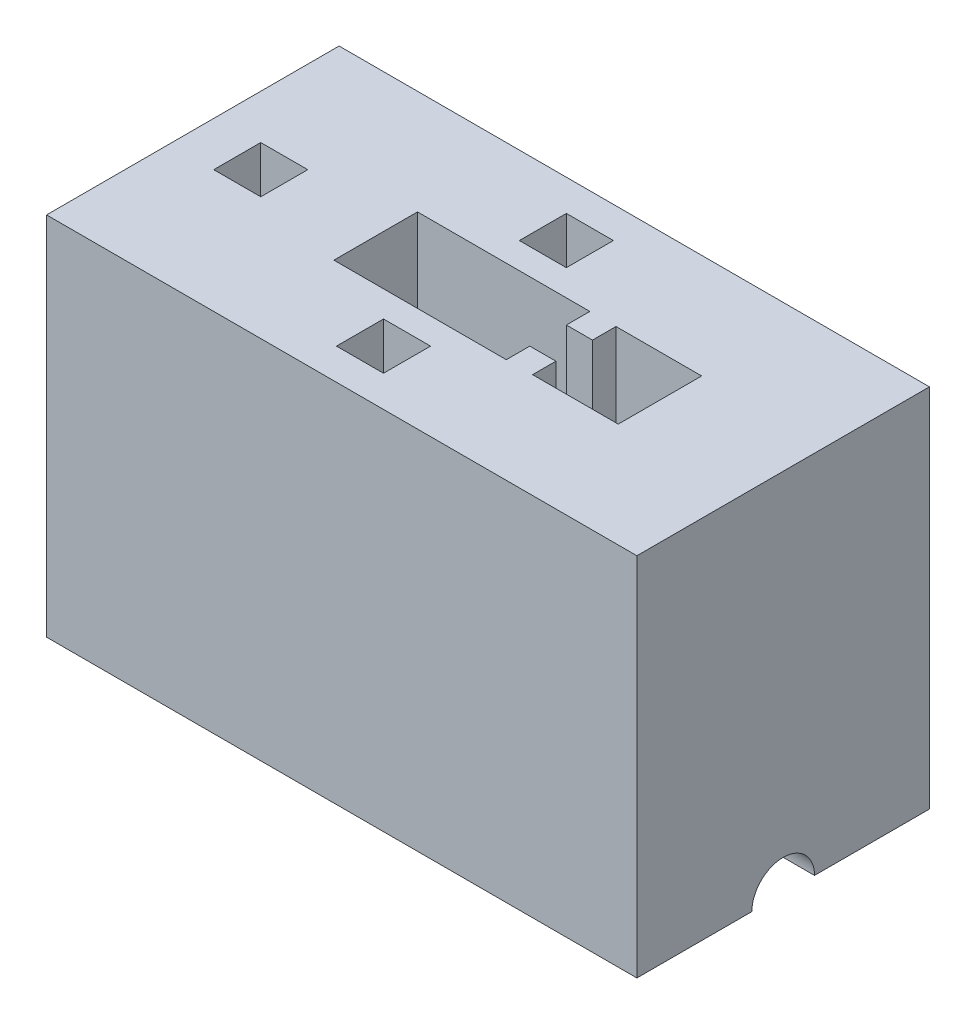
ISO-10303-21;
HEADER;
FILE_DESCRIPTION(('STEP AP214'),'2;1');
FILE_NAME('part.step','',(''),(''),'','','');
FILE_SCHEMA(('AUTOMOTIVE_DESIGN { 1 0 10303 214 1 1 1 1 }'));
ENDSEC;
DATA;
#1=APPLICATION_CONTEXT('core data for automotive mechanical design processes');
#2=APPLICATION_PROTOCOL_DEFINITION('international standard','automotive_design',2000,#1);
#3=PRODUCT_CONTEXT('',#1,'mechanical');
#4=PRODUCT('Part','Part','',(#3));
#5=PRODUCT_RELATED_PRODUCT_CATEGORY('part','',(#4));
#6=PRODUCT_DEFINITION_FORMATION('','',#4);
#7=PRODUCT_DEFINITION_CONTEXT('part definition',#1,'design');
#8=PRODUCT_DEFINITION('design','',#6,#7);
#9=PRODUCT_DEFINITION_SHAPE('','',#8);
#10=(LENGTH_UNIT() NAMED_UNIT(*) SI_UNIT(.MILLI.,.METRE.));
#11=(NAMED_UNIT(*) PLANE_ANGLE_UNIT() SI_UNIT($,.RADIAN.));
#12=(NAMED_UNIT(*) SI_UNIT($,.STERADIAN.) SOLID_ANGLE_UNIT());
#13=UNCERTAINTY_MEASURE_WITH_UNIT(LENGTH_MEASURE(1.E-05),#10,'distance_accuracy_value','');
#14=(GEOMETRIC_REPRESENTATION_CONTEXT(3) GLOBAL_UNCERTAINTY_ASSIGNED_CONTEXT((#13)) GLOBAL_UNIT_ASSIGNED_CONTEXT((#10,
#11,#12)) REPRESENTATION_CONTEXT('',''));
#15=CARTESIAN_POINT('',(0.,0.,0.));
#16=DIRECTION('',(0.,0.,1.));
#17=DIRECTION('',(1.,0.,0.));
#18=AXIS2_PLACEMENT_3D('',#15,#16,#17);
#19=CARTESIAN_POINT('',(0.,0.,0.));
#20=DIRECTION('',(0.,1.,0.));
#21=DIRECTION('',(0.,0.,1.));
#22=AXIS2_PLACEMENT_3D('',#19,#20,#21);
#23=PLANE('',#22);
#24=DIRECTION('',(0.,0.,-1.));
#25=VECTOR('',#24,1.);
#26=CARTESIAN_POINT('',(22.7334686346863,0.,-11.7533579335793));
#27=LINE('',#26,#25);
#28=CARTESIAN_POINT('',(22.7334686346864,0.,41.5866420664206));
#29=VERTEX_POINT('',#28);
#30=CARTESIAN_POINT('',(22.7334686346863,0.,13.6466420664207));
#31=VERTEX_POINT('',#30);
#32=EDGE_CURVE('E263',#29,#31,#27,.T.);
#33=ORIENTED_EDGE('',*,*,#32,.F.);
#34=DIRECTION('',(-1.,0.,0.));
#35=VECTOR('',#34,1.);
#36=CARTESIAN_POINT('',(22.7334686346864,0.,41.5866420664206));
#37=LINE('',#36,#35);
#38=CARTESIAN_POINT('',(11.9384686346863,0.,41.5866420664206));
#39=VERTEX_POINT('',#38);
#40=EDGE_CURVE('E567',#29,#39,#37,.T.);
#41=ORIENTED_EDGE('',*,*,#40,.T.);
#42=DIRECTION('',(0.,0.,1.));
#43=VECTOR('',#42,1.);
#44=CARTESIAN_POINT('',(11.9384686346863,0.,77.1466420664207));
#45=LINE('',#44,#43);
#46=CARTESIAN_POINT('',(11.9384686346863,0.,21.2666420664207));
#47=VERTEX_POINT('',#46);
#48=EDGE_CURVE('E408',#47,#39,#45,.T.);
#49=ORIENTED_EDGE('',*,*,#48,.F.);
#50=DIRECTION('',(1.,0.,0.));
#51=VECTOR('',#50,1.);
#52=CARTESIAN_POINT('',(-109.981531365314,0.,21.2666420664207));
#53=LINE('',#52,#51);
#54=CARTESIAN_POINT('',(-109.981531365314,0.,21.2666420664207));
#55=VERTEX_POINT('',#54);
#56=EDGE_CURVE('E404',#55,#47,#53,.T.);
#57=ORIENTED_EDGE('',*,*,#56,.F.);
#58=DIRECTION('',(0.,0.,-1.));
#59=VECTOR('',#58,1.);
#60=CARTESIAN_POINT('',(-109.981531365314,0.,77.1466420664207));
#61=LINE('',#60,#59);
#62=CARTESIAN_POINT('',(-109.981531365314,0.,41.5866420664206));
#63=VERTEX_POINT('',#62);
#64=EDGE_CURVE('E405',#63,#55,#61,.T.);
#65=ORIENTED_EDGE('',*,*,#64,.F.);
#66=CARTESIAN_POINT('',(-120.776531365314,0.,41.5866420664206));
#67=VERTEX_POINT('',#66);
#68=EDGE_CURVE('E52',#63,#67,#37,.T.);
#69=ORIENTED_EDGE('',*,*,#68,.T.);
#70=DIRECTION('',(0.,0.,1.));
#71=VECTOR('',#70,1.);
#72=CARTESIAN_POINT('',(-120.776531365314,0.,-11.7533579335793));
#73=LINE('',#72,#71);
#74=CARTESIAN_POINT('',(-120.776531365314,0.,13.6466420664206));
#75=VERTEX_POINT('',#74);
#76=EDGE_CURVE('E277',#75,#67,#73,.T.);
#77=ORIENTED_EDGE('',*,*,#76,.F.);
#78=DIRECTION('',(-1.,0.,0.));
#79=VECTOR('',#78,1.);
#80=CARTESIAN_POINT('',(-120.776531365314,0.,13.6466420664206));
#81=LINE('',#80,#79);
#82=EDGE_CURVE('E281',#31,#75,#81,.T.);
#83=ORIENTED_EDGE('',*,*,#82,.F.);
#84=EDGE_LOOP('',(#33,#41,#49,#57,#65,#69,#77,#83));
#85=FACE_BOUND('',#84,.T.);
#86=ADVANCED_FACE('F34',(#85),#23,.F.);
#87=CARTESIAN_POINT('',(-120.776531365314,88.9,-11.7533579335793));
#88=DIRECTION('',(1.,0.,0.));
#89=DIRECTION('',(0.,0.,-1.));
#90=AXIS2_PLACEMENT_3D('',#87,#88,#89);
#91=PLANE('',#90);
#92=ORIENTED_EDGE('',*,*,#76,.T.);
#93=CARTESIAN_POINT('',(-120.776531365314,0.,49.2066420664206));
#94=DIRECTION('',(-1.,0.,0.));
#95=DIRECTION('',(0.,0.,1.));
#96=AXIS2_PLACEMENT_3D('',#93,#94,#95);
#97=CIRCLE('',#96,7.62);
#98=CARTESIAN_POINT('',(-120.776531365314,0.,56.8266420664206));
#99=VERTEX_POINT('',#98);
#100=EDGE_CURVE('E38',#99,#67,#97,.T.);
#101=ORIENTED_EDGE('',*,*,#100,.F.);
#102=CARTESIAN_POINT('',(-120.776531365314,0.,84.7666420664206));
#103=VERTEX_POINT('',#102);
#104=EDGE_CURVE('E467',#99,#103,#73,.T.);
#105=ORIENTED_EDGE('',*,*,#104,.T.);
#106=DIRECTION('',(0.,-1.,0.));
#107=VECTOR('',#106,1.);
#108=CARTESIAN_POINT('',(-120.776531365314,88.9,84.7666420664206));
#109=LINE('',#108,#107);
#110=CARTESIAN_POINT('',(-120.776531365314,88.9,84.7666420664206));
#111=VERTEX_POINT('',#110);
#112=EDGE_CURVE('E587',#111,#103,#109,.T.);
#113=ORIENTED_EDGE('',*,*,#112,.F.);
#114=DIRECTION('',(0.,0.,1.));
#115=VECTOR('',#114,1.);
#116=CARTESIAN_POINT('',(-120.776531365314,88.9,-11.7533579335793));
#117=LINE('',#116,#115);
#118=CARTESIAN_POINT('',(-120.776531365314,88.9,13.6466420664206));
#119=VERTEX_POINT('',#118);
#120=EDGE_CURVE('E478',#119,#111,#117,.T.);
#121=ORIENTED_EDGE('',*,*,#120,.F.);
#122=DIRECTION('',(0.,-1.,0.));
#123=VECTOR('',#122,1.);
#124=CARTESIAN_POINT('',(-120.776531365314,88.9,13.6466420664206));
#125=LINE('',#124,#123);
#126=EDGE_CURVE('E285',#119,#75,#125,.T.);
#127=ORIENTED_EDGE('',*,*,#126,.T.);
#128=EDGE_LOOP('',(#92,#101,#105,#113,#121,#127));
#129=FACE_BOUND('',#128,.T.);
#130=ADVANCED_FACE('F36',(#129),#91,.F.);
#131=CARTESIAN_POINT('',(22.7334686346863,88.9,-11.7533579335793));
#132=DIRECTION('',(-1.,0.,0.));
#133=DIRECTION('',(0.,0.,1.));
#134=AXIS2_PLACEMENT_3D('',#131,#132,#133);
#135=PLANE('',#134);
#136=CARTESIAN_POINT('',(22.7334686346863,0.,84.7666420664206));
#137=VERTEX_POINT('',#136);
#138=CARTESIAN_POINT('',(22.7334686346864,0.,56.8266420664206));
#139=VERTEX_POINT('',#138);
#140=EDGE_CURVE('E276',#137,#139,#27,.T.);
#141=ORIENTED_EDGE('',*,*,#140,.T.);
#142=CARTESIAN_POINT('',(22.7334686346864,0.,49.2066420664206));
#143=DIRECTION('',(-1.,0.,0.));
#144=DIRECTION('',(0.,0.,1.));
#145=AXIS2_PLACEMENT_3D('',#142,#143,#144);
#146=CIRCLE('',#145,7.62);
#147=EDGE_CURVE('E272',#139,#29,#146,.T.);
#148=ORIENTED_EDGE('',*,*,#147,.T.);
#149=ORIENTED_EDGE('',*,*,#32,.T.);
#150=DIRECTION('',(0.,-1.,0.));
#151=VECTOR('',#150,1.);
#152=CARTESIAN_POINT('',(22.7334686346864,88.9,13.6466420664207));
#153=LINE('',#152,#151);
#154=CARTESIAN_POINT('',(22.7334686346864,88.9,13.6466420664207));
#155=VERTEX_POINT('',#154);
#156=EDGE_CURVE('E268',#155,#31,#153,.T.);
#157=ORIENTED_EDGE('',*,*,#156,.F.);
#158=DIRECTION('',(0.,0.,-1.));
#159=VECTOR('',#158,1.);
#160=CARTESIAN_POINT('',(22.7334686346863,88.9,-11.7533579335793));
#161=LINE('',#160,#159);
#162=CARTESIAN_POINT('',(22.7334686346863,88.9,84.7666420664206));
#163=VERTEX_POINT('',#162);
#164=EDGE_CURVE('E481',#163,#155,#161,.T.);
#165=ORIENTED_EDGE('',*,*,#164,.F.);
#166=DIRECTION('',(0.,-1.,0.));
#167=VECTOR('',#166,1.);
#168=CARTESIAN_POINT('',(22.7334686346863,88.9,84.7666420664206));
#169=LINE('',#168,#167);
#170=EDGE_CURVE('E298',#163,#137,#169,.T.);
#171=ORIENTED_EDGE('',*,*,#170,.T.);
#172=EDGE_LOOP('',(#141,#148,#149,#157,#165,#171));
#173=FACE_BOUND('',#172,.T.);
#174=ADVANCED_FACE('F266',(#173),#135,.F.);
#175=CARTESIAN_POINT('',(0.,88.9,0.));
#176=DIRECTION('',(0.,1.,0.));
#177=DIRECTION('',(0.,0.,1.));
#178=AXIS2_PLACEMENT_3D('',#175,#176,#177);
#179=PLANE('',#178);
#180=DIRECTION('',(1.,0.,0.));
#181=VECTOR('',#180,1.);
#182=CARTESIAN_POINT('',(-120.776531365314,88.9,84.7666420664206));
#183=LINE('',#182,#181);
#184=EDGE_CURVE('E584',#111,#163,#183,.T.);
#185=ORIENTED_EDGE('',*,*,#184,.T.);
#186=ORIENTED_EDGE('',*,*,#164,.T.);
#187=DIRECTION('',(-1.,0.,0.));
#188=VECTOR('',#187,1.);
#189=CARTESIAN_POINT('',(-120.776531365314,88.9,13.6466420664206));
#190=LINE('',#189,#188);
#191=EDGE_CURVE('E284',#155,#119,#190,.T.);
#192=ORIENTED_EDGE('',*,*,#191,.T.);
#193=ORIENTED_EDGE('',*,*,#120,.T.);
#194=EDGE_LOOP('',(#185,#186,#192,#193));
#195=FACE_BOUND('',#194,.T.);
#196=DIRECTION('',(0.,0.,1.));
#197=VECTOR('',#196,1.);
#198=CARTESIAN_POINT('',(-109.981531365314,88.9,43.4916420664207));
#199=LINE('',#198,#197);
#200=CARTESIAN_POINT('',(-109.981531365314,88.9,43.4916420664207));
#201=VERTEX_POINT('',#200);
#202=CARTESIAN_POINT('',(-109.981531365314,88.9,54.9216420664207));
#203=VERTEX_POINT('',#202);
#204=EDGE_CURVE('E295',#201,#203,#199,.T.);
#205=ORIENTED_EDGE('',*,*,#204,.F.);
#206=DIRECTION('',(-1.,0.,0.));
#207=VECTOR('',#206,1.);
#208=CARTESIAN_POINT('',(-109.981531365314,88.9,43.4916420664207));
#209=LINE('',#208,#207);
#210=CARTESIAN_POINT('',(-98.5515313653137,88.9,43.4916420664207));
#211=VERTEX_POINT('',#210);
#212=EDGE_CURVE('E304',#211,#201,#209,.T.);
#213=ORIENTED_EDGE('',*,*,#212,.F.);
#214=DIRECTION('',(0.,0.,-1.));
#215=VECTOR('',#214,1.);
#216=CARTESIAN_POINT('',(-98.5515313653137,88.9,43.4916420664207));
#217=LINE('',#216,#215);
#218=CARTESIAN_POINT('',(-98.5515313653136,88.9,54.9216420664207));
#219=VERTEX_POINT('',#218);
#220=EDGE_CURVE('E301',#219,#211,#217,.T.);
#221=ORIENTED_EDGE('',*,*,#220,.F.);
#222=DIRECTION('',(1.,0.,0.));
#223=VECTOR('',#222,1.);
#224=CARTESIAN_POINT('',(-109.981531365314,88.9,54.9216420664207));
#225=LINE('',#224,#223);
#226=EDGE_CURVE('E297',#203,#219,#225,.T.);
#227=ORIENTED_EDGE('',*,*,#226,.F.);
#228=EDGE_LOOP('',(#205,#213,#221,#227));
#229=FACE_BOUND('',#228,.T.);
#230=DIRECTION('',(0.,0.,1.));
#231=VECTOR('',#230,1.);
#232=CARTESIAN_POINT('',(-57.9115313653136,88.9,65.7166420664207));
#233=LINE('',#232,#231);
#234=CARTESIAN_POINT('',(-57.9115313653136,88.9,65.7166420664207));
#235=VERTEX_POINT('',#234);
#236=CARTESIAN_POINT('',(-57.9115313653136,88.9,77.1466420664207));
#237=VERTEX_POINT('',#236);
#238=EDGE_CURVE('E310',#235,#237,#233,.T.);
#239=ORIENTED_EDGE('',*,*,#238,.F.);
#240=DIRECTION('',(-1.,0.,0.));
#241=VECTOR('',#240,1.);
#242=CARTESIAN_POINT('',(-57.9115313653136,88.9,65.7166420664207));
#243=LINE('',#242,#241);
#244=CARTESIAN_POINT('',(-46.4815313653136,88.9,65.7166420664207));
#245=VERTEX_POINT('',#244);
#246=EDGE_CURVE('E324',#245,#235,#243,.T.);
#247=ORIENTED_EDGE('',*,*,#246,.F.);
#248=DIRECTION('',(0.,0.,-1.));
#249=VECTOR('',#248,1.);
#250=CARTESIAN_POINT('',(-46.4815313653136,88.9,65.7166420664207));
#251=LINE('',#250,#249);
#252=CARTESIAN_POINT('',(-46.4815313653136,88.9,77.1466420664207));
#253=VERTEX_POINT('',#252);
#254=EDGE_CURVE('E321',#253,#245,#251,.T.);
#255=ORIENTED_EDGE('',*,*,#254,.F.);
#256=DIRECTION('',(1.,0.,0.));
#257=VECTOR('',#256,1.);
#258=CARTESIAN_POINT('',(-57.9115313653136,88.9,77.1466420664207));
#259=LINE('',#258,#257);
#260=EDGE_CURVE('E318',#237,#253,#259,.T.);
#261=ORIENTED_EDGE('',*,*,#260,.F.);
#262=EDGE_LOOP('',(#239,#247,#255,#261));
#263=FACE_BOUND('',#262,.T.);
#264=DIRECTION('',(0.,0.,1.));
#265=VECTOR('',#264,1.);
#266=CARTESIAN_POINT('',(-57.9115313653136,88.9,21.2666420664207));
#267=LINE('',#266,#265);
#268=CARTESIAN_POINT('',(-57.9115313653136,88.9,21.2666420664207));
#269=VERTEX_POINT('',#268);
#270=CARTESIAN_POINT('',(-57.9115313653136,88.9,32.6966420664207));
#271=VERTEX_POINT('',#270);
#272=EDGE_CURVE('E330',#269,#271,#267,.T.);
#273=ORIENTED_EDGE('',*,*,#272,.F.);
#274=DIRECTION('',(-1.,0.,0.));
#275=VECTOR('',#274,1.);
#276=CARTESIAN_POINT('',(-57.9115313653136,88.9,21.2666420664207));
#277=LINE('',#276,#275);
#278=CARTESIAN_POINT('',(-46.4815313653136,88.9,21.2666420664207));
#279=VERTEX_POINT('',#278);
#280=EDGE_CURVE('E344',#279,#269,#277,.T.);
#281=ORIENTED_EDGE('',*,*,#280,.F.);
#282=DIRECTION('',(0.,0.,-1.));
#283=VECTOR('',#282,1.);
#284=CARTESIAN_POINT('',(-46.4815313653136,88.9,21.2666420664207));
#285=LINE('',#284,#283);
#286=CARTESIAN_POINT('',(-46.4815313653136,88.9,32.6966420664207));
#287=VERTEX_POINT('',#286);
#288=EDGE_CURVE('E341',#287,#279,#285,.T.);
#289=ORIENTED_EDGE('',*,*,#288,.F.);
#290=DIRECTION('',(1.,0.,0.));
#291=VECTOR('',#290,1.);
#292=CARTESIAN_POINT('',(-57.9115313653136,88.9,32.6966420664207));
#293=LINE('',#292,#291);
#294=EDGE_CURVE('E338',#271,#287,#293,.T.);
#295=ORIENTED_EDGE('',*,*,#294,.F.);
#296=EDGE_LOOP('',(#273,#281,#289,#295));
#297=FACE_BOUND('',#296,.T.);
#298=DIRECTION('',(0.,0.,1.));
#299=VECTOR('',#298,1.);
#300=CARTESIAN_POINT('',(-28.0665313653136,88.9,0.));
#301=LINE('',#300,#299);
#302=CARTESIAN_POINT('',(-28.0665313653136,88.9,39.0466420664207));
#303=VERTEX_POINT('',#302);
#304=CARTESIAN_POINT('',(-28.0665313653136,88.9,44.7616420664207));
#305=VERTEX_POINT('',#304);
#306=EDGE_CURVE('E384',#303,#305,#301,.T.);
#307=ORIENTED_EDGE('',*,*,#306,.F.);
#308=DIRECTION('',(-1.,0.,0.));
#309=VECTOR('',#308,1.);
#310=CARTESIAN_POINT('',(0.,88.9,39.0466420664207));
#311=LINE('',#310,#309);
#312=CARTESIAN_POINT('',(-7.24360300156826,88.9,39.0466420664207));
#313=VERTEX_POINT('',#312);
#314=EDGE_CURVE('E360',#313,#303,#311,.T.);
#315=ORIENTED_EDGE('',*,*,#314,.F.);
#316=DIRECTION('',(0.,0.,-1.));
#317=VECTOR('',#316,1.);
#318=CARTESIAN_POINT('',(-7.24360300156826,88.9,0.));
#319=LINE('',#318,#317);
#320=CARTESIAN_POINT('',(-7.24360300156826,88.9,59.324734092015));
#321=VERTEX_POINT('',#320);
#322=EDGE_CURVE('E369',#321,#313,#319,.T.);
#323=ORIENTED_EDGE('',*,*,#322,.F.);
#324=DIRECTION('',(1.,0.,0.));
#325=VECTOR('',#324,1.);
#326=CARTESIAN_POINT('',(0.,88.9,59.324734092015));
#327=LINE('',#326,#325);
#328=CARTESIAN_POINT('',(-28.0665313653136,88.9,59.324734092015));
#329=VERTEX_POINT('',#328);
#330=EDGE_CURVE('E371',#329,#321,#327,.T.);
#331=ORIENTED_EDGE('',*,*,#330,.F.);
#332=CARTESIAN_POINT('',(-28.0665313653136,88.9,53.6516420664207));
#333=VERTEX_POINT('',#332);
#334=EDGE_CURVE('E382',#333,#329,#301,.T.);
#335=ORIENTED_EDGE('',*,*,#334,.F.);
#336=DIRECTION('',(1.,0.,0.));
#337=VECTOR('',#336,1.);
#338=CARTESIAN_POINT('',(-19.1765313653136,88.9,53.6516420664207));
#339=LINE('',#338,#337);
#340=CARTESIAN_POINT('',(-34.4165313653136,88.9,53.6516420664207));
#341=VERTEX_POINT('',#340);
#342=EDGE_CURVE('E428',#341,#333,#339,.T.);
#343=ORIENTED_EDGE('',*,*,#342,.F.);
#344=DIRECTION('',(0.,0.,-1.));
#345=VECTOR('',#344,1.);
#346=CARTESIAN_POINT('',(-34.4165313653136,88.9,53.6516420664207));
#347=LINE('',#346,#345);
#348=CARTESIAN_POINT('',(-34.4165313653136,88.9,59.3666420664207));
#349=VERTEX_POINT('',#348);
#350=EDGE_CURVE('E460',#349,#341,#347,.T.);
#351=ORIENTED_EDGE('',*,*,#350,.F.);
#352=DIRECTION('',(1.,0.,0.));
#353=VECTOR('',#352,1.);
#354=CARTESIAN_POINT('',(-76.3265313653136,88.9,59.3666420664207));
#355=LINE('',#354,#353);
#356=CARTESIAN_POINT('',(-76.3265313653136,88.9,59.3666420664207));
#357=VERTEX_POINT('',#356);
#358=EDGE_CURVE('E457',#357,#349,#355,.T.);
#359=ORIENTED_EDGE('',*,*,#358,.F.);
#360=DIRECTION('',(0.,0.,1.));
#361=VECTOR('',#360,1.);
#362=CARTESIAN_POINT('',(-76.3265313653136,88.9,39.0466420664207));
#363=LINE('',#362,#361);
#364=CARTESIAN_POINT('',(-76.3265313653136,88.9,39.0466420664207));
#365=VERTEX_POINT('',#364);
#366=EDGE_CURVE('E454',#365,#357,#363,.T.);
#367=ORIENTED_EDGE('',*,*,#366,.F.);
#368=DIRECTION('',(-1.,0.,0.));
#369=VECTOR('',#368,1.);
#370=CARTESIAN_POINT('',(-76.3265313653136,88.9,39.0466420664207));
#371=LINE('',#370,#369);
#372=CARTESIAN_POINT('',(-34.4165313653136,88.9,39.0466420664207));
#373=VERTEX_POINT('',#372);
#374=EDGE_CURVE('E451',#373,#365,#371,.T.);
#375=ORIENTED_EDGE('',*,*,#374,.F.);
#376=DIRECTION('',(0.,0.,-1.));
#377=VECTOR('',#376,1.);
#378=CARTESIAN_POINT('',(-34.4165313653136,88.9,39.0466420664207));
#379=LINE('',#378,#377);
#380=CARTESIAN_POINT('',(-34.4165313653136,88.9,44.7616420664207));
#381=VERTEX_POINT('',#380);
#382=EDGE_CURVE('E448',#381,#373,#379,.T.);
#383=ORIENTED_EDGE('',*,*,#382,.F.);
#384=DIRECTION('',(-1.,0.,0.));
#385=VECTOR('',#384,1.);
#386=CARTESIAN_POINT('',(-34.4165313653136,88.9,44.7616420664207));
#387=LINE('',#386,#385);
#388=EDGE_CURVE('E416',#305,#381,#387,.T.);
#389=ORIENTED_EDGE('',*,*,#388,.F.);
#390=EDGE_LOOP('',(#307,#315,#323,#331,#335,#343,#351,#359,#367,#375,#383,#389));
#391=FACE_BOUND('',#390,.T.);
#392=ADVANCED_FACE('F535',(#195,#229,#263,#297,#391),#179,.T.);
#393=ORIENTED_EDGE('',*,*,#104,.F.);
#394=DIRECTION('',(-1.,0.,0.));
#395=VECTOR('',#394,1.);
#396=CARTESIAN_POINT('',(22.7334686346864,0.,56.8266420664206));
#397=LINE('',#396,#395);
#398=CARTESIAN_POINT('',(-109.981531365314,0.,56.8266420664206));
#399=VERTEX_POINT('',#398);
#400=EDGE_CURVE('E63',#399,#99,#397,.T.);
#401=ORIENTED_EDGE('',*,*,#400,.F.);
#402=CARTESIAN_POINT('',(-109.981531365314,0.,77.1466420664207));
#403=VERTEX_POINT('',#402);
#404=EDGE_CURVE('E401',#403,#399,#61,.T.);
#405=ORIENTED_EDGE('',*,*,#404,.F.);
#406=DIRECTION('',(-1.,0.,0.));
#407=VECTOR('',#406,1.);
#408=CARTESIAN_POINT('',(-109.981531365314,0.,77.1466420664207));
#409=LINE('',#408,#407);
#410=CARTESIAN_POINT('',(11.9384686346863,0.,77.1466420664207));
#411=VERTEX_POINT('',#410);
#412=EDGE_CURVE('E411',#411,#403,#409,.T.);
#413=ORIENTED_EDGE('',*,*,#412,.F.);
#414=CARTESIAN_POINT('',(11.9384686346863,0.,56.8266420664206));
#415=VERTEX_POINT('',#414);
#416=EDGE_CURVE('E407',#415,#411,#45,.T.);
#417=ORIENTED_EDGE('',*,*,#416,.F.);
#418=EDGE_CURVE('E579',#139,#415,#397,.T.);
#419=ORIENTED_EDGE('',*,*,#418,.F.);
#420=ORIENTED_EDGE('',*,*,#140,.F.);
#421=DIRECTION('',(1.,0.,0.));
#422=VECTOR('',#421,1.);
#423=CARTESIAN_POINT('',(-120.776531365314,0.,84.7666420664206));
#424=LINE('',#423,#422);
#425=EDGE_CURVE('E293',#103,#137,#424,.T.);
#426=ORIENTED_EDGE('',*,*,#425,.F.);
#427=EDGE_LOOP('',(#393,#401,#405,#413,#417,#419,#420,#426));
#428=FACE_BOUND('',#427,.T.);
#429=ADVANCED_FACE('F538',(#428),#23,.F.);
#430=CARTESIAN_POINT('',(-19.1765313653136,63.246,53.6516420664207));
#431=DIRECTION('',(0.,0.,1.));
#432=DIRECTION('',(1.,0.,0.));
#433=AXIS2_PLACEMENT_3D('',#430,#431,#432);
#434=PLANE('',#433);
#435=ORIENTED_EDGE('',*,*,#342,.T.);
#436=DIRECTION('',(0.,-1.,0.));
#437=VECTOR('',#436,1.);
#438=CARTESIAN_POINT('',(-28.0665313653136,63.246,53.6516420664207));
#439=LINE('',#438,#437);
#440=CARTESIAN_POINT('',(-28.0665313653136,63.246,53.6516420664207));
#441=VERTEX_POINT('',#440);
#442=EDGE_CURVE('E379',#333,#441,#439,.T.);
#443=ORIENTED_EDGE('',*,*,#442,.T.);
#444=DIRECTION('',(1.,0.,0.));
#445=VECTOR('',#444,1.);
#446=CARTESIAN_POINT('',(-19.1765313653136,63.246,53.6516420664207));
#447=LINE('',#446,#445);
#448=CARTESIAN_POINT('',(-34.4165313653136,63.246,53.6516420664207));
#449=VERTEX_POINT('',#448);
#450=EDGE_CURVE('E443',#449,#441,#447,.T.);
#451=ORIENTED_EDGE('',*,*,#450,.F.);
#452=DIRECTION('',(0.,1.,0.));
#453=VECTOR('',#452,1.);
#454=CARTESIAN_POINT('',(-34.4165313653136,63.246,53.6516420664207));
#455=LINE('',#454,#453);
#456=EDGE_CURVE('E465',#449,#341,#455,.T.);
#457=ORIENTED_EDGE('',*,*,#456,.T.);
#458=EDGE_LOOP('',(#435,#443,#451,#457));
#459=FACE_BOUND('',#458,.T.);
#460=ADVANCED_FACE('F613',(#459),#434,.F.);
#461=CARTESIAN_POINT('',(-34.4165313653136,63.246,53.6516420664207));
#462=DIRECTION('',(1.,0.,0.));
#463=DIRECTION('',(0.,0.,-1.));
#464=AXIS2_PLACEMENT_3D('',#461,#462,#463);
#465=PLANE('',#464);
#466=ORIENTED_EDGE('',*,*,#350,.T.);
#467=ORIENTED_EDGE('',*,*,#456,.F.);
#468=DIRECTION('',(0.,0.,-1.));
#469=VECTOR('',#468,1.);
#470=CARTESIAN_POINT('',(-34.4165313653136,63.246,53.6516420664207));
#471=LINE('',#470,#469);
#472=CARTESIAN_POINT('',(-34.4165313653136,63.246,59.3666420664207));
#473=VERTEX_POINT('',#472);
#474=EDGE_CURVE('E440',#473,#449,#471,.T.);
#475=ORIENTED_EDGE('',*,*,#474,.F.);
#476=DIRECTION('',(0.,1.,0.));
#477=VECTOR('',#476,1.);
#478=CARTESIAN_POINT('',(-34.4165313653136,63.246,59.3666420664207));
#479=LINE('',#478,#477);
#480=EDGE_CURVE('E468',#473,#349,#479,.T.);
#481=ORIENTED_EDGE('',*,*,#480,.T.);
#482=EDGE_LOOP('',(#466,#467,#475,#481));
#483=FACE_BOUND('',#482,.T.);
#484=ADVANCED_FACE('F617',(#483),#465,.F.);
#485=CARTESIAN_POINT('',(-76.3265313653136,63.246,59.3666420664207));
#486=DIRECTION('',(0.,0.,1.));
#487=DIRECTION('',(1.,0.,0.));
#488=AXIS2_PLACEMENT_3D('',#485,#486,#487);
#489=PLANE('',#488);
#490=ORIENTED_EDGE('',*,*,#358,.T.);
#491=ORIENTED_EDGE('',*,*,#480,.F.);
#492=DIRECTION('',(1.,0.,0.));
#493=VECTOR('',#492,1.);
#494=CARTESIAN_POINT('',(-76.3265313653136,63.246,59.3666420664207));
#495=LINE('',#494,#493);
#496=CARTESIAN_POINT('',(-76.3265313653136,63.246,59.3666420664207));
#497=VERTEX_POINT('',#496);
#498=EDGE_CURVE('E437',#497,#473,#495,.T.);
#499=ORIENTED_EDGE('',*,*,#498,.F.);
#500=DIRECTION('',(0.,1.,0.));
#501=VECTOR('',#500,1.);
#502=CARTESIAN_POINT('',(-76.3265313653136,63.246,59.3666420664207));
#503=LINE('',#502,#501);
#504=EDGE_CURVE('E470',#497,#357,#503,.T.);
#505=ORIENTED_EDGE('',*,*,#504,.T.);
#506=EDGE_LOOP('',(#490,#491,#499,#505));
#507=FACE_BOUND('',#506,.T.);
#508=ADVANCED_FACE('F623',(#507),#489,.F.);
#509=CARTESIAN_POINT('',(-76.3265313653136,63.246,39.0466420664207));
#510=DIRECTION('',(-1.,0.,0.));
#511=DIRECTION('',(0.,0.,1.));
#512=AXIS2_PLACEMENT_3D('',#509,#510,#511);
#513=PLANE('',#512);
#514=ORIENTED_EDGE('',*,*,#366,.T.);
#515=ORIENTED_EDGE('',*,*,#504,.F.);
#516=DIRECTION('',(0.,0.,1.));
#517=VECTOR('',#516,1.);
#518=CARTESIAN_POINT('',(-76.3265313653136,63.246,39.0466420664207));
#519=LINE('',#518,#517);
#520=CARTESIAN_POINT('',(-76.3265313653136,63.246,39.0466420664207));
#521=VERTEX_POINT('',#520);
#522=EDGE_CURVE('E434',#521,#497,#519,.T.);
#523=ORIENTED_EDGE('',*,*,#522,.F.);
#524=DIRECTION('',(0.,1.,0.));
#525=VECTOR('',#524,1.);
#526=CARTESIAN_POINT('',(-76.3265313653136,63.246,39.0466420664207));
#527=LINE('',#526,#525);
#528=EDGE_CURVE('E472',#521,#365,#527,.T.);
#529=ORIENTED_EDGE('',*,*,#528,.T.);
#530=EDGE_LOOP('',(#514,#515,#523,#529));
#531=FACE_BOUND('',#530,.T.);
#532=ADVANCED_FACE('F632',(#531),#513,.F.);
#533=CARTESIAN_POINT('',(-76.3265313653136,63.246,39.0466420664207));
#534=DIRECTION('',(0.,0.,-1.));
#535=DIRECTION('',(-1.,0.,0.));
#536=AXIS2_PLACEMENT_3D('',#533,#534,#535);
#537=PLANE('',#536);
#538=ORIENTED_EDGE('',*,*,#374,.T.);
#539=ORIENTED_EDGE('',*,*,#528,.F.);
#540=DIRECTION('',(-1.,0.,0.));
#541=VECTOR('',#540,1.);
#542=CARTESIAN_POINT('',(-76.3265313653136,63.246,39.0466420664207));
#543=LINE('',#542,#541);
#544=CARTESIAN_POINT('',(-34.4165313653136,63.246,39.0466420664207));
#545=VERTEX_POINT('',#544);
#546=EDGE_CURVE('E431',#545,#521,#543,.T.);
#547=ORIENTED_EDGE('',*,*,#546,.F.);
#548=DIRECTION('',(0.,1.,0.));
#549=VECTOR('',#548,1.);
#550=CARTESIAN_POINT('',(-34.4165313653136,63.246,39.0466420664207));
#551=LINE('',#550,#549);
#552=EDGE_CURVE('E474',#545,#373,#551,.T.);
#553=ORIENTED_EDGE('',*,*,#552,.T.);
#554=EDGE_LOOP('',(#538,#539,#547,#553));
#555=FACE_BOUND('',#554,.T.);
#556=ADVANCED_FACE('F636',(#555),#537,.F.);
#557=CARTESIAN_POINT('',(-34.4165313653136,63.246,39.0466420664207));
#558=DIRECTION('',(1.,0.,0.));
#559=DIRECTION('',(0.,0.,-1.));
#560=AXIS2_PLACEMENT_3D('',#557,#558,#559);
#561=PLANE('',#560);
#562=ORIENTED_EDGE('',*,*,#382,.T.);
#563=ORIENTED_EDGE('',*,*,#552,.F.);
#564=DIRECTION('',(0.,0.,-1.));
#565=VECTOR('',#564,1.);
#566=CARTESIAN_POINT('',(-34.4165313653136,63.246,39.0466420664207));
#567=LINE('',#566,#565);
#568=CARTESIAN_POINT('',(-34.4165313653136,63.246,44.7616420664207));
#569=VERTEX_POINT('',#568);
#570=EDGE_CURVE('E427',#569,#545,#567,.T.);
#571=ORIENTED_EDGE('',*,*,#570,.F.);
#572=DIRECTION('',(0.,1.,0.));
#573=VECTOR('',#572,1.);
#574=CARTESIAN_POINT('',(-34.4165313653136,63.246,44.7616420664207));
#575=LINE('',#574,#573);
#576=EDGE_CURVE('E446',#569,#381,#575,.T.);
#577=ORIENTED_EDGE('',*,*,#576,.T.);
#578=EDGE_LOOP('',(#562,#563,#571,#577));
#579=FACE_BOUND('',#578,.T.);
#580=ADVANCED_FACE('F640',(#579),#561,.F.);
#581=CARTESIAN_POINT('',(-34.4165313653136,63.246,44.7616420664207));
#582=DIRECTION('',(0.,0.,-1.));
#583=DIRECTION('',(-1.,0.,0.));
#584=AXIS2_PLACEMENT_3D('',#581,#582,#583);
#585=PLANE('',#584);
#586=DIRECTION('',(-1.,0.,0.));
#587=VECTOR('',#586,1.);
#588=CARTESIAN_POINT('',(-34.4165313653136,63.246,44.7616420664207));
#589=LINE('',#588,#587);
#590=CARTESIAN_POINT('',(-28.0665313653136,63.246,44.7616420664207));
#591=VERTEX_POINT('',#590);
#592=EDGE_CURVE('E425',#591,#569,#589,.T.);
#593=ORIENTED_EDGE('',*,*,#592,.F.);
#594=DIRECTION('',(0.,1.,0.));
#595=VECTOR('',#594,1.);
#596=CARTESIAN_POINT('',(-28.0665313653136,63.246,44.7616420664207));
#597=LINE('',#596,#595);
#598=EDGE_CURVE('E376',#591,#305,#597,.T.);
#599=ORIENTED_EDGE('',*,*,#598,.T.);
#600=ORIENTED_EDGE('',*,*,#388,.T.);
#601=ORIENTED_EDGE('',*,*,#576,.F.);
#602=EDGE_LOOP('',(#593,#599,#600,#601));
#603=FACE_BOUND('',#602,.T.);
#604=ADVANCED_FACE('F644',(#603),#585,.F.);
#605=CARTESIAN_POINT('',(0.,63.246,0.));
#606=DIRECTION('',(0.,-1.,0.));
#607=DIRECTION('',(0.,0.,-1.));
#608=AXIS2_PLACEMENT_3D('',#605,#606,#607);
#609=PLANE('',#608);
#610=ORIENTED_EDGE('',*,*,#450,.T.);
#611=DIRECTION('',(0.,0.,-1.));
#612=VECTOR('',#611,1.);
#613=CARTESIAN_POINT('',(-28.0665313653136,63.246,0.));
#614=LINE('',#613,#612);
#615=EDGE_CURVE('E373',#441,#591,#614,.T.);
#616=ORIENTED_EDGE('',*,*,#615,.T.);
#617=ORIENTED_EDGE('',*,*,#592,.T.);
#618=ORIENTED_EDGE('',*,*,#570,.T.);
#619=ORIENTED_EDGE('',*,*,#546,.T.);
#620=ORIENTED_EDGE('',*,*,#522,.T.);
#621=ORIENTED_EDGE('',*,*,#498,.T.);
#622=ORIENTED_EDGE('',*,*,#474,.T.);
#623=EDGE_LOOP('',(#610,#616,#617,#618,#619,#620,#621,#622));
#624=FACE_BOUND('',#623,.T.);
#625=ADVANCED_FACE('F627',(#624),#609,.F.);
#626=CARTESIAN_POINT('',(-109.981531365314,50.8,77.1466420664207));
#627=DIRECTION('',(-1.,0.,0.));
#628=DIRECTION('',(0.,0.,1.));
#629=AXIS2_PLACEMENT_3D('',#626,#627,#628);
#630=PLANE('',#629);
#631=ORIENTED_EDGE('',*,*,#404,.T.);
#632=CARTESIAN_POINT('',(-109.981531365314,0.,49.2066420664206));
#633=DIRECTION('',(-1.,0.,0.));
#634=DIRECTION('',(0.,0.,1.));
#635=AXIS2_PLACEMENT_3D('',#632,#633,#634);
#636=CIRCLE('',#635,7.62);
#637=EDGE_CURVE('E69',#399,#63,#636,.T.);
#638=ORIENTED_EDGE('',*,*,#637,.T.);
#639=ORIENTED_EDGE('',*,*,#64,.T.);
#640=DIRECTION('',(0.,-1.,0.));
#641=VECTOR('',#640,1.);
#642=CARTESIAN_POINT('',(-109.981531365314,50.8,21.2666420664207));
#643=LINE('',#642,#641);
#644=CARTESIAN_POINT('',(-109.981531365314,50.8,21.2666420664207));
#645=VERTEX_POINT('',#644);
#646=EDGE_CURVE('E400',#645,#55,#643,.T.);
#647=ORIENTED_EDGE('',*,*,#646,.F.);
#648=DIRECTION('',(0.,0.,-1.));
#649=VECTOR('',#648,1.);
#650=CARTESIAN_POINT('',(-109.981531365314,50.8,77.1466420664207));
#651=LINE('',#650,#649);
#652=CARTESIAN_POINT('',(-109.981531365314,50.8,43.4916420664207));
#653=VERTEX_POINT('',#652);
#654=EDGE_CURVE('E389',#653,#645,#651,.T.);
#655=ORIENTED_EDGE('',*,*,#654,.F.);
#656=DIRECTION('',(0.,1.,0.));
#657=VECTOR('',#656,1.);
#658=CARTESIAN_POINT('',(-109.981531365314,0.,43.4916420664207));
#659=LINE('',#658,#657);
#660=EDGE_CURVE('E308',#653,#201,#659,.T.);
#661=ORIENTED_EDGE('',*,*,#660,.T.);
#662=ORIENTED_EDGE('',*,*,#204,.T.);
#663=DIRECTION('',(0.,1.,0.));
#664=VECTOR('',#663,1.);
#665=CARTESIAN_POINT('',(-109.981531365314,0.,54.9216420664207));
#666=LINE('',#665,#664);
#667=CARTESIAN_POINT('',(-109.981531365314,50.8,54.9216420664207));
#668=VERTEX_POINT('',#667);
#669=EDGE_CURVE('E307',#668,#203,#666,.T.);
#670=ORIENTED_EDGE('',*,*,#669,.F.);
#671=CARTESIAN_POINT('',(-109.981531365314,50.8,77.1466420664207));
#672=VERTEX_POINT('',#671);
#673=EDGE_CURVE('E385',#672,#668,#651,.T.);
#674=ORIENTED_EDGE('',*,*,#673,.F.);
#675=DIRECTION('',(0.,-1.,0.));
#676=VECTOR('',#675,1.);
#677=CARTESIAN_POINT('',(-109.981531365314,50.8,77.1466420664207));
#678=LINE('',#677,#676);
#679=EDGE_CURVE('E413',#672,#403,#678,.T.);
#680=ORIENTED_EDGE('',*,*,#679,.T.);
#681=EDGE_LOOP('',(#631,#638,#639,#647,#655,#661,#662,#670,#674,#680));
#682=FACE_BOUND('',#681,.T.);
#683=ADVANCED_FACE('F532',(#682),#630,.F.);
#684=CARTESIAN_POINT('',(-109.981531365314,50.8,77.1466420664207));
#685=DIRECTION('',(0.,0.,1.));
#686=DIRECTION('',(1.,0.,0.));
#687=AXIS2_PLACEMENT_3D('',#684,#685,#686);
#688=PLANE('',#687);
#689=ORIENTED_EDGE('',*,*,#412,.T.);
#690=ORIENTED_EDGE('',*,*,#679,.F.);
#691=DIRECTION('',(-1.,0.,0.));
#692=VECTOR('',#691,1.);
#693=CARTESIAN_POINT('',(-109.981531365314,50.8,77.1466420664207));
#694=LINE('',#693,#692);
#695=CARTESIAN_POINT('',(-57.9115313653136,50.8,77.1466420664207));
#696=VERTEX_POINT('',#695);
#697=EDGE_CURVE('E396',#696,#672,#694,.T.);
#698=ORIENTED_EDGE('',*,*,#697,.F.);
#699=DIRECTION('',(0.,1.,0.));
#700=VECTOR('',#699,1.);
#701=CARTESIAN_POINT('',(-57.9115313653136,0.,77.1466420664207));
#702=LINE('',#701,#700);
#703=EDGE_CURVE('E327',#696,#237,#702,.T.);
#704=ORIENTED_EDGE('',*,*,#703,.T.);
#705=ORIENTED_EDGE('',*,*,#260,.T.);
#706=DIRECTION('',(0.,1.,0.));
#707=VECTOR('',#706,1.);
#708=CARTESIAN_POINT('',(-46.4815313653136,0.,77.1466420664207));
#709=LINE('',#708,#707);
#710=CARTESIAN_POINT('',(-46.4815313653137,50.8,77.1466420664207));
#711=VERTEX_POINT('',#710);
#712=EDGE_CURVE('E333',#711,#253,#709,.T.);
#713=ORIENTED_EDGE('',*,*,#712,.F.);
#714=CARTESIAN_POINT('',(11.9384686346863,50.8,77.1466420664207));
#715=VERTEX_POINT('',#714);
#716=EDGE_CURVE('E397',#715,#711,#694,.T.);
#717=ORIENTED_EDGE('',*,*,#716,.F.);
#718=DIRECTION('',(0.,-1.,0.));
#719=VECTOR('',#718,1.);
#720=CARTESIAN_POINT('',(11.9384686346863,50.8,77.1466420664207));
#721=LINE('',#720,#719);
#722=EDGE_CURVE('E417',#715,#411,#721,.T.);
#723=ORIENTED_EDGE('',*,*,#722,.T.);
#724=EDGE_LOOP('',(#689,#690,#698,#704,#705,#713,#717,#723));
#725=FACE_BOUND('',#724,.T.);
#726=ADVANCED_FACE('F690',(#725),#688,.F.);
#727=CARTESIAN_POINT('',(11.9384686346863,50.8,77.1466420664207));
#728=DIRECTION('',(1.,0.,0.));
#729=DIRECTION('',(0.,0.,-1.));
#730=AXIS2_PLACEMENT_3D('',#727,#728,#729);
#731=PLANE('',#730);
#732=ORIENTED_EDGE('',*,*,#48,.T.);
#733=CARTESIAN_POINT('',(11.9384686346863,0.,49.2066420664206));
#734=DIRECTION('',(1.,0.,0.));
#735=DIRECTION('',(0.,0.,-1.));
#736=AXIS2_PLACEMENT_3D('',#733,#734,#735);
#737=CIRCLE('',#736,7.62);
#738=EDGE_CURVE('E11',#39,#415,#737,.T.);
#739=ORIENTED_EDGE('',*,*,#738,.T.);
#740=ORIENTED_EDGE('',*,*,#416,.T.);
#741=ORIENTED_EDGE('',*,*,#722,.F.);
#742=DIRECTION('',(0.,0.,1.));
#743=VECTOR('',#742,1.);
#744=CARTESIAN_POINT('',(11.9384686346863,50.8,77.1466420664207));
#745=LINE('',#744,#743);
#746=CARTESIAN_POINT('',(11.9384686346863,50.8,21.2666420664207));
#747=VERTEX_POINT('',#746);
#748=EDGE_CURVE('E393',#747,#715,#745,.T.);
#749=ORIENTED_EDGE('',*,*,#748,.F.);
#750=DIRECTION('',(0.,-1.,0.));
#751=VECTOR('',#750,1.);
#752=CARTESIAN_POINT('',(11.9384686346863,50.8,21.2666420664207));
#753=LINE('',#752,#751);
#754=EDGE_CURVE('E420',#747,#47,#753,.T.);
#755=ORIENTED_EDGE('',*,*,#754,.T.);
#756=EDGE_LOOP('',(#732,#739,#740,#741,#749,#755));
#757=FACE_BOUND('',#756,.T.);
#758=ADVANCED_FACE('F569',(#757),#731,.F.);
#759=CARTESIAN_POINT('',(-109.981531365314,50.8,21.2666420664207));
#760=DIRECTION('',(0.,0.,-1.));
#761=DIRECTION('',(-1.,0.,0.));
#762=AXIS2_PLACEMENT_3D('',#759,#760,#761);
#763=PLANE('',#762);
#764=DIRECTION('',(1.,0.,0.));
#765=VECTOR('',#764,1.);
#766=CARTESIAN_POINT('',(-109.981531365314,50.8,21.2666420664207));
#767=LINE('',#766,#765);
#768=CARTESIAN_POINT('',(-46.4815313653136,50.8,21.2666420664207));
#769=VERTEX_POINT('',#768);
#770=EDGE_CURVE('E388',#769,#747,#767,.T.);
#771=ORIENTED_EDGE('',*,*,#770,.F.);
#772=DIRECTION('',(0.,1.,0.));
#773=VECTOR('',#772,1.);
#774=CARTESIAN_POINT('',(-46.4815313653136,0.,21.2666420664207));
#775=LINE('',#774,#773);
#776=EDGE_CURVE('E351',#769,#279,#775,.T.);
#777=ORIENTED_EDGE('',*,*,#776,.T.);
#778=ORIENTED_EDGE('',*,*,#280,.T.);
#779=DIRECTION('',(0.,1.,0.));
#780=VECTOR('',#779,1.);
#781=CARTESIAN_POINT('',(-57.9115313653136,0.,21.2666420664207));
#782=LINE('',#781,#780);
#783=CARTESIAN_POINT('',(-57.9115313653136,50.8,21.2666420664207));
#784=VERTEX_POINT('',#783);
#785=EDGE_CURVE('E348',#784,#269,#782,.T.);
#786=ORIENTED_EDGE('',*,*,#785,.F.);
#787=EDGE_CURVE('E390',#645,#784,#767,.T.);
#788=ORIENTED_EDGE('',*,*,#787,.F.);
#789=ORIENTED_EDGE('',*,*,#646,.T.);
#790=ORIENTED_EDGE('',*,*,#56,.T.);
#791=ORIENTED_EDGE('',*,*,#754,.F.);
#792=EDGE_LOOP('',(#771,#777,#778,#786,#788,#789,#790,#791));
#793=FACE_BOUND('',#792,.T.);
#794=ADVANCED_FACE('F562',(#793),#763,.F.);
#795=CARTESIAN_POINT('',(0.,50.8,0.));
#796=DIRECTION('',(0.,-1.,0.));
#797=DIRECTION('',(0.,0.,-1.));
#798=AXIS2_PLACEMENT_3D('',#795,#796,#797);
#799=PLANE('',#798);
#800=DIRECTION('',(1.,0.,0.));
#801=VECTOR('',#800,1.);
#802=CARTESIAN_POINT('',(0.,50.8,43.4916420664207));
#803=LINE('',#802,#801);
#804=CARTESIAN_POINT('',(-98.5515313653137,50.8,43.4916420664207));
#805=VERTEX_POINT('',#804);
#806=EDGE_CURVE('E44',#653,#805,#803,.T.);
#807=ORIENTED_EDGE('',*,*,#806,.F.);
#808=ORIENTED_EDGE('',*,*,#654,.T.);
#809=ORIENTED_EDGE('',*,*,#787,.T.);
#810=DIRECTION('',(0.,0.,-1.));
#811=VECTOR('',#810,1.);
#812=CARTESIAN_POINT('',(-57.9115313653136,50.8,0.));
#813=LINE('',#812,#811);
#814=CARTESIAN_POINT('',(-57.9115313653136,50.8,32.6966420664207));
#815=VERTEX_POINT('',#814);
#816=EDGE_CURVE('E498',#815,#784,#813,.T.);
#817=ORIENTED_EDGE('',*,*,#816,.F.);
#818=DIRECTION('',(-1.,0.,0.));
#819=VECTOR('',#818,1.);
#820=CARTESIAN_POINT('',(0.,50.8,32.6966420664207));
#821=LINE('',#820,#819);
#822=CARTESIAN_POINT('',(-46.4815313653136,50.8,32.6966420664207));
#823=VERTEX_POINT('',#822);
#824=EDGE_CURVE('E493',#823,#815,#821,.T.);
#825=ORIENTED_EDGE('',*,*,#824,.F.);
#826=DIRECTION('',(0.,0.,1.));
#827=VECTOR('',#826,1.);
#828=CARTESIAN_POINT('',(-46.4815313653136,50.8,0.));
#829=LINE('',#828,#827);
#830=EDGE_CURVE('E495',#769,#823,#829,.T.);
#831=ORIENTED_EDGE('',*,*,#830,.F.);
#832=ORIENTED_EDGE('',*,*,#770,.T.);
#833=ORIENTED_EDGE('',*,*,#748,.T.);
#834=ORIENTED_EDGE('',*,*,#716,.T.);
#835=DIRECTION('',(0.,0.,1.));
#836=VECTOR('',#835,1.);
#837=CARTESIAN_POINT('',(-46.4815313653136,50.8,0.));
#838=LINE('',#837,#836);
#839=CARTESIAN_POINT('',(-46.4815313653136,50.8,65.7166420664207));
#840=VERTEX_POINT('',#839);
#841=EDGE_CURVE('E500',#840,#711,#838,.T.);
#842=ORIENTED_EDGE('',*,*,#841,.F.);
#843=DIRECTION('',(1.,0.,0.));
#844=VECTOR('',#843,1.);
#845=CARTESIAN_POINT('',(0.,50.8,65.7166420664207));
#846=LINE('',#845,#844);
#847=CARTESIAN_POINT('',(-57.9115313653136,50.8,65.7166420664207));
#848=VERTEX_POINT('',#847);
#849=EDGE_CURVE('E503',#848,#840,#846,.T.);
#850=ORIENTED_EDGE('',*,*,#849,.F.);
#851=DIRECTION('',(0.,0.,-1.));
#852=VECTOR('',#851,1.);
#853=CARTESIAN_POINT('',(-57.9115313653136,50.8,0.));
#854=LINE('',#853,#852);
#855=EDGE_CURVE('E505',#696,#848,#854,.T.);
#856=ORIENTED_EDGE('',*,*,#855,.F.);
#857=ORIENTED_EDGE('',*,*,#697,.T.);
#858=ORIENTED_EDGE('',*,*,#673,.T.);
#859=DIRECTION('',(-1.,0.,0.));
#860=VECTOR('',#859,1.);
#861=CARTESIAN_POINT('',(0.,50.8,54.9216420664207));
#862=LINE('',#861,#860);
#863=CARTESIAN_POINT('',(-98.5515313653136,50.8,54.9216420664207));
#864=VERTEX_POINT('',#863);
#865=EDGE_CURVE('E507',#864,#668,#862,.T.);
#866=ORIENTED_EDGE('',*,*,#865,.F.);
#867=DIRECTION('',(0.,0.,1.));
#868=VECTOR('',#867,1.);
#869=CARTESIAN_POINT('',(-98.5515313653137,50.8,1.19656801436832E-13));
#870=LINE('',#869,#868);
#871=EDGE_CURVE('E509',#805,#864,#870,.T.);
#872=ORIENTED_EDGE('',*,*,#871,.F.);
#873=EDGE_LOOP('',(#807,#808,#809,#817,#825,#831,#832,#833,#834,#842,#850,#856,#857,#858,#866,#872));
#874=FACE_BOUND('',#873,.T.);
#875=DIRECTION('',(0.,0.,-1.));
#876=VECTOR('',#875,1.);
#877=CARTESIAN_POINT('',(-28.0665313653136,50.8,0.));
#878=LINE('',#877,#876);
#879=CARTESIAN_POINT('',(-28.0665313653136,50.8,59.324734092015));
#880=VERTEX_POINT('',#879);
#881=CARTESIAN_POINT('',(-28.0665313653136,50.8,39.0466420664207));
#882=VERTEX_POINT('',#881);
#883=EDGE_CURVE('E490',#880,#882,#878,.T.);
#884=ORIENTED_EDGE('',*,*,#883,.F.);
#885=DIRECTION('',(-1.,0.,0.));
#886=VECTOR('',#885,1.);
#887=CARTESIAN_POINT('',(0.,50.8,59.324734092015));
#888=LINE('',#887,#886);
#889=CARTESIAN_POINT('',(-7.24360300156826,50.8,59.324734092015));
#890=VERTEX_POINT('',#889);
#891=EDGE_CURVE('E488',#890,#880,#888,.T.);
#892=ORIENTED_EDGE('',*,*,#891,.F.);
#893=DIRECTION('',(0.,0.,1.));
#894=VECTOR('',#893,1.);
#895=CARTESIAN_POINT('',(-7.24360300156826,50.8,0.));
#896=LINE('',#895,#894);
#897=CARTESIAN_POINT('',(-7.24360300156826,50.8,39.0466420664207));
#898=VERTEX_POINT('',#897);
#899=EDGE_CURVE('E486',#898,#890,#896,.T.);
#900=ORIENTED_EDGE('',*,*,#899,.F.);
#901=DIRECTION('',(1.,0.,0.));
#902=VECTOR('',#901,1.);
#903=CARTESIAN_POINT('',(0.,50.8,39.0466420664207));
#904=LINE('',#903,#902);
#905=EDGE_CURVE('E483',#882,#898,#904,.T.);
#906=ORIENTED_EDGE('',*,*,#905,.F.);
#907=EDGE_LOOP('',(#884,#892,#900,#906));
#908=FACE_BOUND('',#907,.T.);
#909=ADVANCED_FACE('F524',(#874,#908),#799,.T.);
#910=CARTESIAN_POINT('',(-28.0665313653136,99.06,39.0466420664207));
#911=DIRECTION('',(-1.,0.,0.));
#912=DIRECTION('',(0.,0.,1.));
#913=AXIS2_PLACEMENT_3D('',#910,#911,#912);
#914=PLANE('',#913);
#915=ORIENTED_EDGE('',*,*,#306,.T.);
#916=ORIENTED_EDGE('',*,*,#598,.F.);
#917=ORIENTED_EDGE('',*,*,#615,.F.);
#918=ORIENTED_EDGE('',*,*,#442,.F.);
#919=ORIENTED_EDGE('',*,*,#334,.T.);
#920=DIRECTION('',(0.,-1.,0.));
#921=VECTOR('',#920,1.);
#922=CARTESIAN_POINT('',(-28.0665313653136,99.06,59.324734092015));
#923=LINE('',#922,#921);
#924=EDGE_CURVE('E357',#329,#880,#923,.T.);
#925=ORIENTED_EDGE('',*,*,#924,.T.);
#926=ORIENTED_EDGE('',*,*,#883,.T.);
#927=DIRECTION('',(0.,-1.,0.));
#928=VECTOR('',#927,1.);
#929=CARTESIAN_POINT('',(-28.0665313653136,99.06,39.0466420664207));
#930=LINE('',#929,#928);
#931=EDGE_CURVE('E350',#303,#882,#930,.T.);
#932=ORIENTED_EDGE('',*,*,#931,.F.);
#933=EDGE_LOOP('',(#915,#916,#917,#918,#919,#925,#926,#932));
#934=FACE_BOUND('',#933,.T.);
#935=ADVANCED_FACE('F656',(#934),#914,.F.);
#936=CARTESIAN_POINT('',(-28.0665313653136,99.06,59.324734092015));
#937=DIRECTION('',(0.,0.,1.));
#938=DIRECTION('',(1.,0.,0.));
#939=AXIS2_PLACEMENT_3D('',#936,#937,#938);
#940=PLANE('',#939);
#941=ORIENTED_EDGE('',*,*,#330,.T.);
#942=DIRECTION('',(0.,-1.,0.));
#943=VECTOR('',#942,1.);
#944=CARTESIAN_POINT('',(-7.24360300156826,99.06,59.324734092015));
#945=LINE('',#944,#943);
#946=EDGE_CURVE('E361',#321,#890,#945,.T.);
#947=ORIENTED_EDGE('',*,*,#946,.T.);
#948=ORIENTED_EDGE('',*,*,#891,.T.);
#949=ORIENTED_EDGE('',*,*,#924,.F.);
#950=EDGE_LOOP('',(#941,#947,#948,#949));
#951=FACE_BOUND('',#950,.T.);
#952=ADVANCED_FACE('F665',(#951),#940,.F.);
#953=CARTESIAN_POINT('',(-7.24360300156826,99.06,39.0466420664207));
#954=DIRECTION('',(1.,0.,0.));
#955=DIRECTION('',(0.,0.,-1.));
#956=AXIS2_PLACEMENT_3D('',#953,#954,#955);
#957=PLANE('',#956);
#958=ORIENTED_EDGE('',*,*,#322,.T.);
#959=DIRECTION('',(0.,-1.,0.));
#960=VECTOR('',#959,1.);
#961=CARTESIAN_POINT('',(-7.24360300156826,99.06,39.0466420664207));
#962=LINE('',#961,#960);
#963=EDGE_CURVE('E364',#313,#898,#962,.T.);
#964=ORIENTED_EDGE('',*,*,#963,.T.);
#965=ORIENTED_EDGE('',*,*,#899,.T.);
#966=ORIENTED_EDGE('',*,*,#946,.F.);
#967=EDGE_LOOP('',(#958,#964,#965,#966));
#968=FACE_BOUND('',#967,.T.);
#969=ADVANCED_FACE('F674',(#968),#957,.F.);
#970=CARTESIAN_POINT('',(-28.0665313653136,99.06,39.0466420664207));
#971=DIRECTION('',(0.,0.,-1.));
#972=DIRECTION('',(-1.,0.,0.));
#973=AXIS2_PLACEMENT_3D('',#970,#971,#972);
#974=PLANE('',#973);
#975=ORIENTED_EDGE('',*,*,#314,.T.);
#976=ORIENTED_EDGE('',*,*,#931,.T.);
#977=ORIENTED_EDGE('',*,*,#905,.T.);
#978=ORIENTED_EDGE('',*,*,#963,.F.);
#979=EDGE_LOOP('',(#975,#976,#977,#978));
#980=FACE_BOUND('',#979,.T.);
#981=ADVANCED_FACE('F671',(#980),#974,.F.);
#982=CARTESIAN_POINT('',(-57.9115313653136,0.,21.2666420664207));
#983=DIRECTION('',(-1.,0.,0.));
#984=DIRECTION('',(0.,0.,1.));
#985=AXIS2_PLACEMENT_3D('',#982,#983,#984);
#986=PLANE('',#985);
#987=ORIENTED_EDGE('',*,*,#816,.T.);
#988=ORIENTED_EDGE('',*,*,#785,.T.);
#989=ORIENTED_EDGE('',*,*,#272,.T.);
#990=DIRECTION('',(0.,1.,0.));
#991=VECTOR('',#990,1.);
#992=CARTESIAN_POINT('',(-57.9115313653136,0.,32.6966420664207));
#993=LINE('',#992,#991);
#994=EDGE_CURVE('E347',#815,#271,#993,.T.);
#995=ORIENTED_EDGE('',*,*,#994,.F.);
#996=EDGE_LOOP('',(#987,#988,#989,#995));
#997=FACE_BOUND('',#996,.T.);
#998=ADVANCED_FACE('F681',(#997),#986,.F.);
#999=CARTESIAN_POINT('',(-46.4815313653136,0.,21.2666420664207));
#1000=DIRECTION('',(1.,0.,0.));
#1001=DIRECTION('',(0.,0.,-1.));
#1002=AXIS2_PLACEMENT_3D('',#999,#1000,#1001);
#1003=PLANE('',#1002);
#1004=ORIENTED_EDGE('',*,*,#830,.T.);
#1005=DIRECTION('',(0.,1.,0.));
#1006=VECTOR('',#1005,1.);
#1007=CARTESIAN_POINT('',(-46.4815313653136,0.,32.6966420664207));
#1008=LINE('',#1007,#1006);
#1009=EDGE_CURVE('E353',#823,#287,#1008,.T.);
#1010=ORIENTED_EDGE('',*,*,#1009,.T.);
#1011=ORIENTED_EDGE('',*,*,#288,.T.);
#1012=ORIENTED_EDGE('',*,*,#776,.F.);
#1013=EDGE_LOOP('',(#1004,#1010,#1011,#1012));
#1014=FACE_BOUND('',#1013,.T.);
#1015=ADVANCED_FACE('F749',(#1014),#1003,.F.);
#1016=CARTESIAN_POINT('',(-57.9115313653136,0.,32.6966420664207));
#1017=DIRECTION('',(0.,0.,1.));
#1018=DIRECTION('',(1.,0.,0.));
#1019=AXIS2_PLACEMENT_3D('',#1016,#1017,#1018);
#1020=PLANE('',#1019);
#1021=ORIENTED_EDGE('',*,*,#824,.T.);
#1022=ORIENTED_EDGE('',*,*,#994,.T.);
#1023=ORIENTED_EDGE('',*,*,#294,.T.);
#1024=ORIENTED_EDGE('',*,*,#1009,.F.);
#1025=EDGE_LOOP('',(#1021,#1022,#1023,#1024));
#1026=FACE_BOUND('',#1025,.T.);
#1027=ADVANCED_FACE('F756',(#1026),#1020,.F.);
#1028=CARTESIAN_POINT('',(-57.9115313653136,0.,65.7166420664207));
#1029=DIRECTION('',(-1.,0.,0.));
#1030=DIRECTION('',(0.,0.,1.));
#1031=AXIS2_PLACEMENT_3D('',#1028,#1029,#1030);
#1032=PLANE('',#1031);
#1033=ORIENTED_EDGE('',*,*,#855,.T.);
#1034=DIRECTION('',(0.,1.,0.));
#1035=VECTOR('',#1034,1.);
#1036=CARTESIAN_POINT('',(-57.9115313653136,0.,65.7166420664207));
#1037=LINE('',#1036,#1035);
#1038=EDGE_CURVE('E328',#848,#235,#1037,.T.);
#1039=ORIENTED_EDGE('',*,*,#1038,.T.);
#1040=ORIENTED_EDGE('',*,*,#238,.T.);
#1041=ORIENTED_EDGE('',*,*,#703,.F.);
#1042=EDGE_LOOP('',(#1033,#1039,#1040,#1041));
#1043=FACE_BOUND('',#1042,.T.);
#1044=ADVANCED_FACE('F763',(#1043),#1032,.F.);
#1045=CARTESIAN_POINT('',(-57.9115313653136,0.,65.7166420664207));
#1046=DIRECTION('',(0.,0.,-1.));
#1047=DIRECTION('',(-1.,0.,0.));
#1048=AXIS2_PLACEMENT_3D('',#1045,#1046,#1047);
#1049=PLANE('',#1048);
#1050=ORIENTED_EDGE('',*,*,#849,.T.);
#1051=DIRECTION('',(0.,1.,0.));
#1052=VECTOR('',#1051,1.);
#1053=CARTESIAN_POINT('',(-46.4815313653136,0.,65.7166420664207));
#1054=LINE('',#1053,#1052);
#1055=EDGE_CURVE('E331',#840,#245,#1054,.T.);
#1056=ORIENTED_EDGE('',*,*,#1055,.T.);
#1057=ORIENTED_EDGE('',*,*,#246,.T.);
#1058=ORIENTED_EDGE('',*,*,#1038,.F.);
#1059=EDGE_LOOP('',(#1050,#1056,#1057,#1058));
#1060=FACE_BOUND('',#1059,.T.);
#1061=ADVANCED_FACE('F770',(#1060),#1049,.F.);
#1062=CARTESIAN_POINT('',(-46.4815313653136,0.,65.7166420664207));
#1063=DIRECTION('',(1.,0.,0.));
#1064=DIRECTION('',(0.,0.,-1.));
#1065=AXIS2_PLACEMENT_3D('',#1062,#1063,#1064);
#1066=PLANE('',#1065);
#1067=ORIENTED_EDGE('',*,*,#841,.T.);
#1068=ORIENTED_EDGE('',*,*,#712,.T.);
#1069=ORIENTED_EDGE('',*,*,#254,.T.);
#1070=ORIENTED_EDGE('',*,*,#1055,.F.);
#1071=EDGE_LOOP('',(#1067,#1068,#1069,#1070));
#1072=FACE_BOUND('',#1071,.T.);
#1073=ADVANCED_FACE('F778',(#1072),#1066,.F.);
#1074=CARTESIAN_POINT('',(-109.981531365314,0.,43.4916420664207));
#1075=DIRECTION('',(0.,0.,-1.));
#1076=DIRECTION('',(-1.,0.,0.));
#1077=AXIS2_PLACEMENT_3D('',#1074,#1075,#1076);
#1078=PLANE('',#1077);
#1079=ORIENTED_EDGE('',*,*,#806,.T.);
#1080=DIRECTION('',(0.,1.,0.));
#1081=VECTOR('',#1080,1.);
#1082=CARTESIAN_POINT('',(-98.5515313653137,0.,43.4916420664207));
#1083=LINE('',#1082,#1081);
#1084=EDGE_CURVE('E311',#805,#211,#1083,.T.);
#1085=ORIENTED_EDGE('',*,*,#1084,.T.);
#1086=ORIENTED_EDGE('',*,*,#212,.T.);
#1087=ORIENTED_EDGE('',*,*,#660,.F.);
#1088=EDGE_LOOP('',(#1079,#1085,#1086,#1087));
#1089=FACE_BOUND('',#1088,.T.);
#1090=ADVANCED_FACE('F515',(#1089),#1078,.F.);
#1091=CARTESIAN_POINT('',(-98.5515313653137,0.,43.4916420664207));
#1092=DIRECTION('',(1.,0.,0.));
#1093=DIRECTION('',(0.,0.,-1.));
#1094=AXIS2_PLACEMENT_3D('',#1091,#1092,#1093);
#1095=PLANE('',#1094);
#1096=ORIENTED_EDGE('',*,*,#871,.T.);
#1097=DIRECTION('',(0.,1.,0.));
#1098=VECTOR('',#1097,1.);
#1099=CARTESIAN_POINT('',(-98.5515313653136,0.,54.9216420664207));
#1100=LINE('',#1099,#1098);
#1101=EDGE_CURVE('E313',#864,#219,#1100,.T.);
#1102=ORIENTED_EDGE('',*,*,#1101,.T.);
#1103=ORIENTED_EDGE('',*,*,#220,.T.);
#1104=ORIENTED_EDGE('',*,*,#1084,.F.);
#1105=EDGE_LOOP('',(#1096,#1102,#1103,#1104));
#1106=FACE_BOUND('',#1105,.T.);
#1107=ADVANCED_FACE('F520',(#1106),#1095,.F.);
#1108=CARTESIAN_POINT('',(-109.981531365314,0.,54.9216420664207));
#1109=DIRECTION('',(0.,0.,1.));
#1110=DIRECTION('',(1.,0.,0.));
#1111=AXIS2_PLACEMENT_3D('',#1108,#1109,#1110);
#1112=PLANE('',#1111);
#1113=ORIENTED_EDGE('',*,*,#865,.T.);
#1114=ORIENTED_EDGE('',*,*,#669,.T.);
#1115=ORIENTED_EDGE('',*,*,#226,.T.);
#1116=ORIENTED_EDGE('',*,*,#1101,.F.);
#1117=EDGE_LOOP('',(#1113,#1114,#1115,#1116));
#1118=FACE_BOUND('',#1117,.T.);
#1119=ADVANCED_FACE('F529',(#1118),#1112,.F.);
#1120=CARTESIAN_POINT('',(-120.776531365314,88.9,13.6466420664206));
#1121=DIRECTION('',(0.,0.,1.));
#1122=DIRECTION('',(1.,0.,0.));
#1123=AXIS2_PLACEMENT_3D('',#1120,#1121,#1122);
#1124=PLANE('',#1123);
#1125=ORIENTED_EDGE('',*,*,#82,.T.);
#1126=ORIENTED_EDGE('',*,*,#126,.F.);
#1127=ORIENTED_EDGE('',*,*,#191,.F.);
#1128=ORIENTED_EDGE('',*,*,#156,.T.);
#1129=EDGE_LOOP('',(#1125,#1126,#1127,#1128));
#1130=FACE_BOUND('',#1129,.T.);
#1131=ADVANCED_FACE('F280',(#1130),#1124,.F.);
#1132=CARTESIAN_POINT('',(-120.776531365314,88.9,84.7666420664206));
#1133=DIRECTION('',(0.,0.,-1.));
#1134=DIRECTION('',(-1.,0.,0.));
#1135=AXIS2_PLACEMENT_3D('',#1132,#1133,#1134);
#1136=PLANE('',#1135);
#1137=ORIENTED_EDGE('',*,*,#425,.T.);
#1138=ORIENTED_EDGE('',*,*,#170,.F.);
#1139=ORIENTED_EDGE('',*,*,#184,.F.);
#1140=ORIENTED_EDGE('',*,*,#112,.T.);
#1141=EDGE_LOOP('',(#1137,#1138,#1139,#1140));
#1142=FACE_BOUND('',#1141,.T.);
#1143=ADVANCED_FACE('F594',(#1142),#1136,.F.);
#1144=CARTESIAN_POINT('',(22.7334686346864,0.,49.2066420664206));
#1145=DIRECTION('',(-1.,0.,0.));
#1146=DIRECTION('',(0.,0.,1.));
#1147=AXIS2_PLACEMENT_3D('',#1144,#1145,#1146);
#1148=CYLINDRICAL_SURFACE('',#1147,7.62);
#1149=ORIENTED_EDGE('',*,*,#40,.F.);
#1150=ORIENTED_EDGE('',*,*,#147,.F.);
#1151=ORIENTED_EDGE('',*,*,#418,.T.);
#1152=ORIENTED_EDGE('',*,*,#738,.F.);
#1153=EDGE_LOOP('',(#1149,#1150,#1151,#1152));
#1154=FACE_BOUND('',#1153,.T.);
#1155=ADVANCED_FACE('F577',(#1154),#1148,.F.);
#1156=ORIENTED_EDGE('',*,*,#68,.F.);
#1157=ORIENTED_EDGE('',*,*,#637,.F.);
#1158=ORIENTED_EDGE('',*,*,#400,.T.);
#1159=ORIENTED_EDGE('',*,*,#100,.T.);
#1160=EDGE_LOOP('',(#1156,#1157,#1158,#1159));
#1161=FACE_BOUND('',#1160,.T.);
#1162=ADVANCED_FACE('F600',(#1161),#1148,.F.);
#1163=CLOSED_SHELL('',(#86,#130,#174,#392,#429,#460,#484,#508,#532,#556,#580,#604,#625,#683,
#726,#758,#794,#909,#935,#952,#969,#981,#998,#1015,#1027,#1044,#1061,#1073,#1090,#1107,#1119,
#1131,#1143,#1155,#1162));
#1164=MANIFOLD_SOLID_BREP('B2',#1163);
#1165=ADVANCED_BREP_SHAPE_REPRESENTATION('',(#18,#1164),#14);
#1166=SHAPE_DEFINITION_REPRESENTATION(#9,#1165);
ENDSEC;
END-ISO-10303-21;
